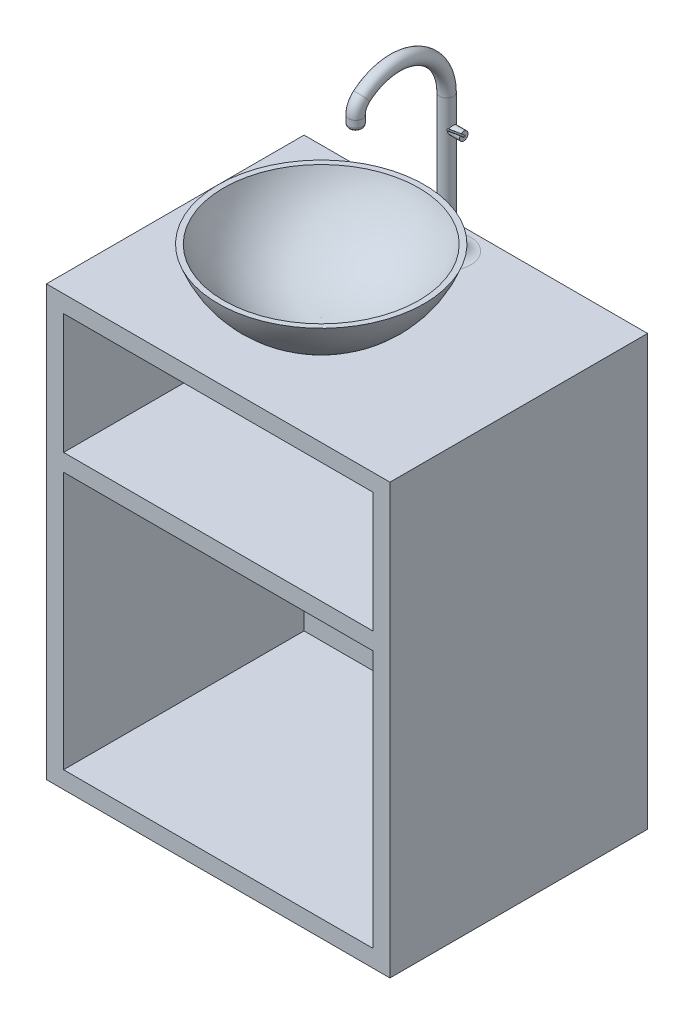
ISO-10303-21;
HEADER;
FILE_DESCRIPTION(('STEP AP214'),'2;1');
FILE_NAME('part.step','',(''),(''),'','','');
FILE_SCHEMA(('AUTOMOTIVE_DESIGN { 1 0 10303 214 1 1 1 1 }'));
ENDSEC;
DATA;
#1=APPLICATION_CONTEXT('core data for automotive mechanical design processes');
#2=APPLICATION_PROTOCOL_DEFINITION('international standard','automotive_design',2000,#1);
#3=PRODUCT_CONTEXT('',#1,'mechanical');
#4=PRODUCT('Part','Part','',(#3));
#5=PRODUCT_RELATED_PRODUCT_CATEGORY('part','',(#4));
#6=PRODUCT_DEFINITION_FORMATION('','',#4);
#7=PRODUCT_DEFINITION_CONTEXT('part definition',#1,'design');
#8=PRODUCT_DEFINITION('design','',#6,#7);
#9=PRODUCT_DEFINITION_SHAPE('','',#8);
#10=(LENGTH_UNIT() NAMED_UNIT(*) SI_UNIT(.MILLI.,.METRE.));
#11=(NAMED_UNIT(*) PLANE_ANGLE_UNIT() SI_UNIT($,.RADIAN.));
#12=(NAMED_UNIT(*) SI_UNIT($,.STERADIAN.) SOLID_ANGLE_UNIT());
#13=UNCERTAINTY_MEASURE_WITH_UNIT(LENGTH_MEASURE(1.E-05),#10,'distance_accuracy_value','');
#14=(GEOMETRIC_REPRESENTATION_CONTEXT(3) GLOBAL_UNCERTAINTY_ASSIGNED_CONTEXT((#13)) GLOBAL_UNIT_ASSIGNED_CONTEXT((#10,
#11,#12)) REPRESENTATION_CONTEXT('',''));
#15=CARTESIAN_POINT('',(0.,0.,0.));
#16=DIRECTION('',(0.,0.,1.));
#17=DIRECTION('',(1.,0.,0.));
#18=AXIS2_PLACEMENT_3D('',#15,#16,#17);
#19=CARTESIAN_POINT('',(0.,12.5,1.7));
#20=DIRECTION('',(0.,1.,0.));
#21=DIRECTION('',(-1.,0.,0.));
#22=AXIS2_PLACEMENT_3D('',#19,#20,#21);
#23=CYLINDRICAL_SURFACE('',#22,0.4);
#24=CARTESIAN_POINT('',(0.,20.5,1.7));
#25=DIRECTION('',(0.,1.,0.));
#26=DIRECTION('',(0.,0.,1.));
#27=AXIS2_PLACEMENT_3D('',#24,#25,#26);
#28=CIRCLE('',#27,0.4);
#29=CARTESIAN_POINT('',(0.,20.5,1.3));
#30=VERTEX_POINT('',#29);
#31=EDGE_CURVE('E202',#30,#30,#28,.T.);
#32=ORIENTED_EDGE('',*,*,#31,.F.);
#33=EDGE_LOOP('',(#32));
#34=FACE_BOUND('',#33,.T.);
#35=CARTESIAN_POINT('',(0.,13.5,1.7));
#36=DIRECTION('',(0.,-1.,0.));
#37=DIRECTION('',(0.,0.,-1.));
#38=AXIS2_PLACEMENT_3D('',#35,#36,#37);
#39=CIRCLE('',#38,0.4);
#40=CARTESIAN_POINT('',(0.,13.5,1.3));
#41=VERTEX_POINT('',#40);
#42=EDGE_CURVE('E336',#41,#41,#39,.F.);
#43=ORIENTED_EDGE('',*,*,#42,.T.);
#44=EDGE_LOOP('',(#43));
#45=FACE_BOUND('',#44,.T.);
#46=CARTESIAN_POINT('',(0.399999999999999,18.55,1.7));
#47=CARTESIAN_POINT('',(0.39999919060617,18.5500008700013,1.71270209460123));
#48=CARTESIAN_POINT('',(0.399388646620892,18.550974602364,1.72541928821109));
#49=CARTESIAN_POINT('',(0.397004335449314,18.5548171606855,1.75046365245271));
#50=CARTESIAN_POINT('',(0.395228351149767,18.5576895987849,1.76279003265964));
#51=CARTESIAN_POINT('',(0.390691705964292,18.5651622726326,1.78664111162753));
#52=CARTESIAN_POINT('',(0.387935921558522,18.5697539575684,1.79816944873335));
#53=CARTESIAN_POINT('',(0.381669196970948,18.5804771701591,1.82025207377333));
#54=CARTESIAN_POINT('',(0.378158340465776,18.586608527201,1.83080646945403));
#55=CARTESIAN_POINT('',(0.370340305809691,18.6007773146379,1.85159483843489));
#56=CARTESIAN_POINT('',(0.365991924469242,18.6089278599984,1.86173591215898));
#57=CARTESIAN_POINT('',(0.357062699807225,18.626643834898,1.88059727502436));
#58=CARTESIAN_POINT('',(0.352481549642063,18.6362111656392,1.88931562142447));
#59=CARTESIAN_POINT('',(0.34286083739574,18.6580067788547,1.90628574649522));
#60=CARTESIAN_POINT('',(0.337843222325162,18.6704199573766,1.91431441214198));
#61=CARTESIAN_POINT('',(0.328660396382606,18.6967129631129,1.92814793211245));
#62=CARTESIAN_POINT('',(0.324493751652602,18.7105902624657,1.93395654179777));
#63=CARTESIAN_POINT('',(0.318619151509393,18.7357621047799,1.94186680116899));
#64=CARTESIAN_POINT('',(0.316553812930075,18.7467933638226,1.9445391047796));
#65=CARTESIAN_POINT('',(0.313562715600758,18.769261185245,1.9483636872148));
#66=CARTESIAN_POINT('',(0.312635347602301,18.7806971516953,1.94951811269557));
#67=CARTESIAN_POINT('',(0.312059771309668,18.8036826033258,1.95023783648051));
#68=CARTESIAN_POINT('',(0.31241491747487,18.8152323072859,1.94979896745278));
#69=CARTESIAN_POINT('',(0.31435480483646,18.8380620206444,1.94735263409654));
#70=CARTESIAN_POINT('',(0.315940531552418,18.8493418064096,1.94534391253086));
#71=CARTESIAN_POINT('',(0.320065146225779,18.8710876905298,1.93993620674219));
#72=CARTESIAN_POINT('',(0.322581430204835,18.8815664911364,1.93657003347359));
#73=CARTESIAN_POINT('',(0.328291132891606,18.9018322364815,1.92858037964208));
#74=CARTESIAN_POINT('',(0.331484791004094,18.911618934975,1.92395645438745));
#75=CARTESIAN_POINT('',(0.338909631984394,18.9321666547664,1.91258978590983));
#76=CARTESIAN_POINT('',(0.343223183151475,18.942768162024,1.90561259320232));
#77=CARTESIAN_POINT('',(0.35201142358293,18.9627660558001,1.89017629260044));
#78=CARTESIAN_POINT('',(0.356486274672079,18.9721611863413,1.88171566160229));
#79=CARTESIAN_POINT('',(0.365959789833566,18.9910603498741,1.86190394260466));
#80=CARTESIAN_POINT('',(0.370923063353148,19.0003265948518,1.85030627071906));
#81=CARTESIAN_POINT('',(0.380056110124929,19.0167701791774,1.82542961991871));
#82=CARTESIAN_POINT('',(0.384226195029536,19.0239483395458,1.8121513047764));
#83=CARTESIAN_POINT('',(0.391106745922625,19.0355527376763,1.78497671258695));
#84=CARTESIAN_POINT('',(0.393883953183153,19.0401068079962,1.77115269154647));
#85=CARTESIAN_POINT('',(0.39796985862009,19.0467529855966,1.742722430915));
#86=CARTESIAN_POINT('',(0.39928063598011,19.0488485788444,1.72811732966827));
#87=CARTESIAN_POINT('',(0.400195681080207,19.0503131700122,1.70090312374811));
#88=CARTESIAN_POINT('',(0.40002432269111,19.0500406355908,1.68831944516721));
#89=CARTESIAN_POINT('',(0.398517802988563,19.0476234343159,1.66340557640077));
#90=CARTESIAN_POINT('',(0.39718272094685,19.0454788949816,1.65107536900757));
#91=CARTESIAN_POINT('',(0.393548104566457,19.0395522926616,1.62749578586825));
#92=CARTESIAN_POINT('',(0.391288341054854,19.0358375686405,1.61622299800894));
#93=CARTESIAN_POINT('',(0.385991368208334,19.0269407221445,1.59447234378622));
#94=CARTESIAN_POINT('',(0.382954028696179,19.0217583539497,1.5839946109074));
#95=CARTESIAN_POINT('',(0.375980024716791,19.0094969588001,1.56298318874284));
#96=CARTESIAN_POINT('',(0.371983529653166,19.0022792861493,1.55255060642466));
#97=CARTESIAN_POINT('',(0.363613939984694,18.9864412269725,1.53297147196319));
#98=CARTESIAN_POINT('',(0.359240429582572,18.9778192821605,1.52382636976658));
#99=CARTESIAN_POINT('',(0.349811739506423,18.9579729921041,1.50570516036657));
#100=CARTESIAN_POINT('',(0.344749767149927,18.9465525586882,1.49694629600613));
#101=CARTESIAN_POINT('',(0.335133525813926,18.9222248429585,1.48143929611524));
#102=CARTESIAN_POINT('',(0.330578906720346,18.9093185986365,1.47468976853544));
#103=CARTESIAN_POINT('',(0.323467060569216,18.8850615703983,1.4646304559976));
#104=CARTESIAN_POINT('',(0.320691272371504,18.8739518498561,1.46089620827473));
#105=CARTESIAN_POINT('',(0.316210061343561,18.8511213708436,1.45499978358383));
#106=CARTESIAN_POINT('',(0.314502966489492,18.839401598109,1.45283515003222));
#107=CARTESIAN_POINT('',(0.312412649973155,18.8155819446246,1.45019723269422));
#108=CARTESIAN_POINT('',(0.31203700334807,18.8034802829026,1.4497336260738));
#109=CARTESIAN_POINT('',(0.312698126220762,18.7793738079266,1.45056044256598));
#110=CARTESIAN_POINT('',(0.313735365191133,18.767369028198,1.4518514486997));
#111=CARTESIAN_POINT('',(0.316910777542705,18.7447940409898,1.45592345519321));
#112=CARTESIAN_POINT('',(0.318953616103162,18.7341861397169,1.45857616100018));
#113=CARTESIAN_POINT('',(0.32383506087034,18.7135729880826,1.46516475306126));
#114=CARTESIAN_POINT('',(0.326673998843327,18.7035679910918,1.46910117440233));
#115=CARTESIAN_POINT('',(0.333327805777765,18.6828806512262,1.47879461911946));
#116=CARTESIAN_POINT('',(0.337224461016908,18.6723099403078,1.48473271108386));
#117=CARTESIAN_POINT('',(0.345335412804811,18.6522123265477,1.49799996593245));
#118=CARTESIAN_POINT('',(0.349549964482648,18.6426862774763,1.50533025344622));
#119=CARTESIAN_POINT('',(0.358803821547984,18.6229971490171,1.52286595569434));
#120=CARTESIAN_POINT('',(0.363841083965482,18.6130818309653,1.53335326505716));
#121=CARTESIAN_POINT('',(0.373397458415354,18.5951010341329,1.55603551071766));
#122=CARTESIAN_POINT('',(0.377916248721884,18.5870367008663,1.5682314969824));
#123=CARTESIAN_POINT('',(0.385973421961887,18.5730457739201,1.59412892001762));
#124=CARTESIAN_POINT('',(0.389510143044564,18.56712279878,1.60783285448334));
#125=CARTESIAN_POINT('',(0.395163043630632,18.5577856230139,1.63632105733881));
#126=CARTESIAN_POINT('',(0.397284242910525,18.5543625530087,1.65110129975402));
#127=CARTESIAN_POINT('',(0.399038944316131,18.5515401581745,1.67171630376043));
#128=CARTESIAN_POINT('',(0.399398344447066,18.5509636269351,1.6773502782289));
#129=CARTESIAN_POINT('',(0.399879060432015,18.5501933416906,1.68865516270111));
#130=CARTESIAN_POINT('',(0.400000361549811,18.5499996113773,1.69432607496918));
#131=CARTESIAN_POINT('',(0.399999999999999,18.55,1.7));
#132=B_SPLINE_CURVE_WITH_KNOTS('',3,(#46,#47,#48,#49,#50,#51,#52,#53,#54,#55,#56,#57,#58,#59,
#60,#61,#62,#63,#64,#65,#66,#67,#68,#69,#70,#71,#72,#73,#74,#75,#76,#77,#78,#79,#80,#81,#82,#83,
#84,#85,#86,#87,#88,#89,#90,#91,#92,#93,#94,#95,#96,#97,#98,#99,#100,#101,#102,#103,#104,#105,
#106,#107,#108,#109,#110,#111,#112,#113,#114,#115,#116,#117,#118,#119,#120,#121,#122,#123,#124,
#125,#126,#127,#128,#129,#130,#131),.UNSPECIFIED.,.T.,.F.,(4,2,2,2,2,2,2,2,2,2,2,2,2,2,2,2,2,2,
2,2,2,2,2,2,2,2,2,2,2,2,2,2,2,2,2,2,2,2,2,2,2,2,4),(0.,0.0380824602868265,0.0762375788256922,
0.114205397519028,0.15216901080776,0.193164374107244,0.234215256651403,0.280825951704689,
0.327357449208691,0.36182401771089,0.396241789318344,0.430749646901123,0.465285168913729,
0.499031678824439,0.53279013571963,0.572854900612281,0.612961045053929,0.659684361302608,
0.706389281359285,0.750568348175482,0.794684695819826,0.83225436109871,0.869821467368124,
0.905919008966159,0.942022597760496,0.981770461884669,1.02156273755893,1.06713141763228,
1.11266845429643,1.14865988053005,1.18459485472932,1.22073394927901,1.25688505503034,
1.2901263379781,1.3233814945295,1.36145104597657,1.39955148221016,1.44520107797777,
1.49087884907221,1.53663345115827,1.5822249218641,1.59923500244025,1.61624613575646),.UNSPECIFIED.);
#133=CARTESIAN_POINT('',(0.399999999999999,18.55,1.7));
#134=VERTEX_POINT('',#133);
#135=EDGE_CURVE('E196',#134,#134,#132,.T.);
#136=ORIENTED_EDGE('',*,*,#135,.T.);
#137=EDGE_LOOP('',(#136));
#138=FACE_BOUND('',#137,.T.);
#139=ADVANCED_FACE('F35',(#34,#45,#138),#23,.T.);
#140=CARTESIAN_POINT('',(10.,12.5,15.));
#141=DIRECTION('',(-1.,0.,0.));
#142=DIRECTION('',(0.,-1.,0.));
#143=AXIS2_PLACEMENT_3D('',#140,#141,#142);
#144=PLANE('',#143);
#145=DIRECTION('',(0.,1.,0.));
#146=VECTOR('',#145,1.);
#147=CARTESIAN_POINT('',(10.,12.5,0.));
#148=LINE('',#147,#146);
#149=CARTESIAN_POINT('',(10.,-12.5,0.));
#150=VERTEX_POINT('',#149);
#151=CARTESIAN_POINT('',(10.,12.5,0.));
#152=VERTEX_POINT('',#151);
#153=EDGE_CURVE('E268',#150,#152,#148,.T.);
#154=ORIENTED_EDGE('',*,*,#153,.T.);
#155=DIRECTION('',(0.,0.,-1.));
#156=VECTOR('',#155,1.);
#157=CARTESIAN_POINT('',(10.,12.5,15.));
#158=LINE('',#157,#156);
#159=CARTESIAN_POINT('',(10.,12.5,15.));
#160=VERTEX_POINT('',#159);
#161=EDGE_CURVE('E331',#160,#152,#158,.T.);
#162=ORIENTED_EDGE('',*,*,#161,.F.);
#163=DIRECTION('',(0.,1.,0.));
#164=VECTOR('',#163,1.);
#165=CARTESIAN_POINT('',(10.,12.5,15.));
#166=LINE('',#165,#164);
#167=CARTESIAN_POINT('',(10.,-12.5,15.));
#168=VERTEX_POINT('',#167);
#169=EDGE_CURVE('E305',#168,#160,#166,.T.);
#170=ORIENTED_EDGE('',*,*,#169,.F.);
#171=DIRECTION('',(0.,0.,-1.));
#172=VECTOR('',#171,1.);
#173=CARTESIAN_POINT('',(10.,-12.5,15.));
#174=LINE('',#173,#172);
#175=EDGE_CURVE('E315',#168,#150,#174,.T.);
#176=ORIENTED_EDGE('',*,*,#175,.T.);
#177=EDGE_LOOP('',(#154,#162,#170,#176));
#178=FACE_BOUND('',#177,.T.);
#179=ADVANCED_FACE('F181',(#178),#144,.F.);
#180=CARTESIAN_POINT('',(-10.,12.5,15.));
#181=DIRECTION('',(0.,-1.,0.));
#182=DIRECTION('',(0.,0.,-1.));
#183=AXIS2_PLACEMENT_3D('',#180,#181,#182);
#184=PLANE('',#183);
#185=CARTESIAN_POINT('',(0.,12.5,1.7));
#186=DIRECTION('',(0.,-1.,0.));
#187=DIRECTION('',(0.,0.,-1.));
#188=AXIS2_PLACEMENT_3D('',#185,#186,#187);
#189=CIRCLE('',#188,1.4);
#190=CARTESIAN_POINT('',(0.,12.5,0.3));
#191=VERTEX_POINT('',#190);
#192=EDGE_CURVE('E145',#191,#191,#189,.T.);
#193=ORIENTED_EDGE('',*,*,#192,.T.);
#194=EDGE_LOOP('',(#193));
#195=FACE_BOUND('',#194,.T.);
#196=CARTESIAN_POINT('',(0.,12.5,9.));
#197=DIRECTION('',(0.,-1.,0.));
#198=DIRECTION('',(0.,0.,-1.));
#199=AXIS2_PLACEMENT_3D('',#196,#197,#198);
#200=CIRCLE('',#199,0.679502625910585);
#201=CARTESIAN_POINT('',(0.,12.5,8.32049737408941));
#202=VERTEX_POINT('',#201);
#203=EDGE_CURVE('E334',#202,#202,#200,.F.);
#204=ORIENTED_EDGE('',*,*,#203,.F.);
#205=EDGE_LOOP('',(#204));
#206=FACE_BOUND('',#205,.T.);
#207=DIRECTION('',(-1.,0.,0.));
#208=VECTOR('',#207,1.);
#209=CARTESIAN_POINT('',(-10.,12.5,0.));
#210=LINE('',#209,#208);
#211=CARTESIAN_POINT('',(-10.,12.5,0.));
#212=VERTEX_POINT('',#211);
#213=EDGE_CURVE('E318',#152,#212,#210,.T.);
#214=ORIENTED_EDGE('',*,*,#213,.T.);
#215=DIRECTION('',(0.,0.,-1.));
#216=VECTOR('',#215,1.);
#217=CARTESIAN_POINT('',(-10.,12.5,15.));
#218=LINE('',#217,#216);
#219=CARTESIAN_POINT('',(-10.,12.5,15.));
#220=VERTEX_POINT('',#219);
#221=EDGE_CURVE('E328',#220,#212,#218,.T.);
#222=ORIENTED_EDGE('',*,*,#221,.F.);
#223=DIRECTION('',(-1.,0.,0.));
#224=VECTOR('',#223,1.);
#225=CARTESIAN_POINT('',(-10.,12.5,15.));
#226=LINE('',#225,#224);
#227=EDGE_CURVE('E308',#160,#220,#226,.T.);
#228=ORIENTED_EDGE('',*,*,#227,.F.);
#229=ORIENTED_EDGE('',*,*,#161,.T.);
#230=EDGE_LOOP('',(#214,#222,#228,#229));
#231=FACE_BOUND('',#230,.T.);
#232=ADVANCED_FACE('F186',(#195,#206,#231),#184,.F.);
#233=CARTESIAN_POINT('',(-10.,12.5,15.));
#234=DIRECTION('',(1.,0.,0.));
#235=DIRECTION('',(0.,1.,0.));
#236=AXIS2_PLACEMENT_3D('',#233,#234,#235);
#237=PLANE('',#236);
#238=DIRECTION('',(0.,-1.,0.));
#239=VECTOR('',#238,1.);
#240=CARTESIAN_POINT('',(-10.,12.5,0.));
#241=LINE('',#240,#239);
#242=CARTESIAN_POINT('',(-10.,-12.5,0.));
#243=VERTEX_POINT('',#242);
#244=EDGE_CURVE('E320',#212,#243,#241,.T.);
#245=ORIENTED_EDGE('',*,*,#244,.T.);
#246=DIRECTION('',(0.,0.,-1.));
#247=VECTOR('',#246,1.);
#248=CARTESIAN_POINT('',(-10.,-12.5,15.));
#249=LINE('',#248,#247);
#250=CARTESIAN_POINT('',(-10.,-12.5,15.));
#251=VERTEX_POINT('',#250);
#252=EDGE_CURVE('E325',#251,#243,#249,.T.);
#253=ORIENTED_EDGE('',*,*,#252,.F.);
#254=DIRECTION('',(0.,-1.,0.));
#255=VECTOR('',#254,1.);
#256=CARTESIAN_POINT('',(-10.,12.5,15.));
#257=LINE('',#256,#255);
#258=EDGE_CURVE('E311',#220,#251,#257,.T.);
#259=ORIENTED_EDGE('',*,*,#258,.F.);
#260=ORIENTED_EDGE('',*,*,#221,.T.);
#261=EDGE_LOOP('',(#245,#253,#259,#260));
#262=FACE_BOUND('',#261,.T.);
#263=ADVANCED_FACE('F421',(#262),#237,.F.);
#264=CARTESIAN_POINT('',(-10.,-12.5,15.));
#265=DIRECTION('',(0.,1.,0.));
#266=DIRECTION('',(0.,0.,1.));
#267=AXIS2_PLACEMENT_3D('',#264,#265,#266);
#268=PLANE('',#267);
#269=DIRECTION('',(1.,0.,0.));
#270=VECTOR('',#269,1.);
#271=CARTESIAN_POINT('',(-10.,-12.5,0.));
#272=LINE('',#271,#270);
#273=EDGE_CURVE('E309',#243,#150,#272,.T.);
#274=ORIENTED_EDGE('',*,*,#273,.T.);
#275=ORIENTED_EDGE('',*,*,#175,.F.);
#276=DIRECTION('',(1.,0.,0.));
#277=VECTOR('',#276,1.);
#278=CARTESIAN_POINT('',(-10.,-12.5,15.));
#279=LINE('',#278,#277);
#280=EDGE_CURVE('E313',#251,#168,#279,.T.);
#281=ORIENTED_EDGE('',*,*,#280,.F.);
#282=ORIENTED_EDGE('',*,*,#252,.T.);
#283=EDGE_LOOP('',(#274,#275,#281,#282));
#284=FACE_BOUND('',#283,.T.);
#285=ADVANCED_FACE('F414',(#284),#268,.F.);
#286=CARTESIAN_POINT('',(0.,0.,15.));
#287=DIRECTION('',(0.,0.,1.));
#288=DIRECTION('',(1.,0.,0.));
#289=AXIS2_PLACEMENT_3D('',#286,#287,#288);
#290=PLANE('',#289);
#291=DIRECTION('',(0.,1.,0.));
#292=VECTOR('',#291,1.);
#293=CARTESIAN_POINT('',(9.,11.5,15.));
#294=LINE('',#293,#292);
#295=CARTESIAN_POINT('',(9.,4.5,15.));
#296=VERTEX_POINT('',#295);
#297=CARTESIAN_POINT('',(9.,11.5,15.));
#298=VERTEX_POINT('',#297);
#299=EDGE_CURVE('E255',#296,#298,#294,.T.);
#300=ORIENTED_EDGE('',*,*,#299,.F.);
#301=DIRECTION('',(1.,0.,0.));
#302=VECTOR('',#301,1.);
#303=CARTESIAN_POINT('',(-9.,4.5,15.));
#304=LINE('',#303,#302);
#305=CARTESIAN_POINT('',(-9.,4.5,15.));
#306=VERTEX_POINT('',#305);
#307=EDGE_CURVE('E245',#306,#296,#304,.T.);
#308=ORIENTED_EDGE('',*,*,#307,.F.);
#309=DIRECTION('',(0.,-1.,0.));
#310=VECTOR('',#309,1.);
#311=CARTESIAN_POINT('',(-9.,11.5,15.));
#312=LINE('',#311,#310);
#313=CARTESIAN_POINT('',(-9.,11.5,15.));
#314=VERTEX_POINT('',#313);
#315=EDGE_CURVE('E261',#314,#306,#312,.T.);
#316=ORIENTED_EDGE('',*,*,#315,.F.);
#317=DIRECTION('',(-1.,0.,0.));
#318=VECTOR('',#317,1.);
#319=CARTESIAN_POINT('',(-9.,11.5,15.));
#320=LINE('',#319,#318);
#321=EDGE_CURVE('E257',#298,#314,#320,.T.);
#322=ORIENTED_EDGE('',*,*,#321,.F.);
#323=EDGE_LOOP('',(#300,#308,#316,#322));
#324=FACE_BOUND('',#323,.T.);
#325=DIRECTION('',(0.,1.,0.));
#326=VECTOR('',#325,1.);
#327=CARTESIAN_POINT('',(9.,3.5,15.));
#328=LINE('',#327,#326);
#329=CARTESIAN_POINT('',(9.00000000000001,-11.5,15.));
#330=VERTEX_POINT('',#329);
#331=CARTESIAN_POINT('',(9.,3.5,15.));
#332=VERTEX_POINT('',#331);
#333=EDGE_CURVE('E240',#330,#332,#328,.T.);
#334=ORIENTED_EDGE('',*,*,#333,.F.);
#335=DIRECTION('',(1.,0.,0.));
#336=VECTOR('',#335,1.);
#337=CARTESIAN_POINT('',(-9.,-11.5,15.));
#338=LINE('',#337,#336);
#339=CARTESIAN_POINT('',(-9.,-11.5,15.));
#340=VERTEX_POINT('',#339);
#341=EDGE_CURVE('E279',#340,#330,#338,.T.);
#342=ORIENTED_EDGE('',*,*,#341,.F.);
#343=DIRECTION('',(0.,-1.,0.));
#344=VECTOR('',#343,1.);
#345=CARTESIAN_POINT('',(-9.,3.5,15.));
#346=LINE('',#345,#344);
#347=CARTESIAN_POINT('',(-9.,3.5,15.));
#348=VERTEX_POINT('',#347);
#349=EDGE_CURVE('E293',#348,#340,#346,.T.);
#350=ORIENTED_EDGE('',*,*,#349,.F.);
#351=DIRECTION('',(-1.,0.,0.));
#352=VECTOR('',#351,1.);
#353=CARTESIAN_POINT('',(-9.,3.5,15.));
#354=LINE('',#353,#352);
#355=EDGE_CURVE('E290',#332,#348,#354,.T.);
#356=ORIENTED_EDGE('',*,*,#355,.F.);
#357=EDGE_LOOP('',(#334,#342,#350,#356));
#358=FACE_BOUND('',#357,.T.);
#359=ORIENTED_EDGE('',*,*,#169,.T.);
#360=ORIENTED_EDGE('',*,*,#227,.T.);
#361=ORIENTED_EDGE('',*,*,#258,.T.);
#362=ORIENTED_EDGE('',*,*,#280,.T.);
#363=EDGE_LOOP('',(#359,#360,#361,#362));
#364=FACE_BOUND('',#363,.T.);
#365=ADVANCED_FACE('F411',(#324,#358,#364),#290,.T.);
#366=CARTESIAN_POINT('',(0.,0.,0.));
#367=DIRECTION('',(0.,0.,1.));
#368=DIRECTION('',(1.,0.,0.));
#369=AXIS2_PLACEMENT_3D('',#366,#367,#368);
#370=PLANE('',#369);
#371=ORIENTED_EDGE('',*,*,#153,.F.);
#372=ORIENTED_EDGE('',*,*,#273,.F.);
#373=ORIENTED_EDGE('',*,*,#244,.F.);
#374=ORIENTED_EDGE('',*,*,#213,.F.);
#375=EDGE_LOOP('',(#371,#372,#373,#374));
#376=FACE_BOUND('',#375,.T.);
#377=ADVANCED_FACE('F409',(#376),#370,.F.);
#378=CARTESIAN_POINT('',(9.,3.5,0.999999999999999));
#379=DIRECTION('',(1.,0.,0.));
#380=DIRECTION('',(0.,1.,0.));
#381=AXIS2_PLACEMENT_3D('',#378,#379,#380);
#382=PLANE('',#381);
#383=ORIENTED_EDGE('',*,*,#333,.T.);
#384=DIRECTION('',(0.,0.,1.));
#385=VECTOR('',#384,1.);
#386=CARTESIAN_POINT('',(9.,3.5,0.999999999999999));
#387=LINE('',#386,#385);
#388=CARTESIAN_POINT('',(9.,3.5,0.999999999999999));
#389=VERTEX_POINT('',#388);
#390=EDGE_CURVE('E288',#389,#332,#387,.T.);
#391=ORIENTED_EDGE('',*,*,#390,.F.);
#392=DIRECTION('',(0.,1.,0.));
#393=VECTOR('',#392,1.);
#394=CARTESIAN_POINT('',(9.,3.5,0.999999999999999));
#395=LINE('',#394,#393);
#396=CARTESIAN_POINT('',(9.00000000000001,-11.5,0.999999999999999));
#397=VERTEX_POINT('',#396);
#398=EDGE_CURVE('E275',#397,#389,#395,.T.);
#399=ORIENTED_EDGE('',*,*,#398,.F.);
#400=DIRECTION('',(0.,0.,1.));
#401=VECTOR('',#400,1.);
#402=CARTESIAN_POINT('',(9.00000000000001,-11.5,0.999999999999999));
#403=LINE('',#402,#401);
#404=EDGE_CURVE('E258',#397,#330,#403,.T.);
#405=ORIENTED_EDGE('',*,*,#404,.T.);
#406=EDGE_LOOP('',(#383,#391,#399,#405));
#407=FACE_BOUND('',#406,.T.);
#408=ADVANCED_FACE('F399',(#407),#382,.F.);
#409=CARTESIAN_POINT('',(-9.,-11.5,0.999999999999999));
#410=DIRECTION('',(0.,-1.,0.));
#411=DIRECTION('',(0.,0.,-1.));
#412=AXIS2_PLACEMENT_3D('',#409,#410,#411);
#413=PLANE('',#412);
#414=ORIENTED_EDGE('',*,*,#341,.T.);
#415=ORIENTED_EDGE('',*,*,#404,.F.);
#416=DIRECTION('',(1.,0.,0.));
#417=VECTOR('',#416,1.);
#418=CARTESIAN_POINT('',(-9.,-11.5,0.999999999999999));
#419=LINE('',#418,#417);
#420=CARTESIAN_POINT('',(-9.,-11.5,0.999999999999999));
#421=VERTEX_POINT('',#420);
#422=EDGE_CURVE('E285',#421,#397,#419,.T.);
#423=ORIENTED_EDGE('',*,*,#422,.F.);
#424=DIRECTION('',(0.,0.,1.));
#425=VECTOR('',#424,1.);
#426=CARTESIAN_POINT('',(-9.,-11.5,0.999999999999999));
#427=LINE('',#426,#425);
#428=EDGE_CURVE('E299',#421,#340,#427,.T.);
#429=ORIENTED_EDGE('',*,*,#428,.T.);
#430=EDGE_LOOP('',(#414,#415,#423,#429));
#431=FACE_BOUND('',#430,.T.);
#432=ADVANCED_FACE('F395',(#431),#413,.F.);
#433=CARTESIAN_POINT('',(-9.,3.5,0.999999999999999));
#434=DIRECTION('',(-1.,0.,0.));
#435=DIRECTION('',(0.,0.,1.));
#436=AXIS2_PLACEMENT_3D('',#433,#434,#435);
#437=PLANE('',#436);
#438=ORIENTED_EDGE('',*,*,#349,.T.);
#439=ORIENTED_EDGE('',*,*,#428,.F.);
#440=DIRECTION('',(0.,-1.,0.));
#441=VECTOR('',#440,1.);
#442=CARTESIAN_POINT('',(-9.,3.5,0.999999999999999));
#443=LINE('',#442,#441);
#444=CARTESIAN_POINT('',(-9.,3.5,0.999999999999999));
#445=VERTEX_POINT('',#444);
#446=EDGE_CURVE('E282',#445,#421,#443,.T.);
#447=ORIENTED_EDGE('',*,*,#446,.F.);
#448=DIRECTION('',(0.,0.,1.));
#449=VECTOR('',#448,1.);
#450=CARTESIAN_POINT('',(-9.,3.5,0.999999999999999));
#451=LINE('',#450,#449);
#452=EDGE_CURVE('E301',#445,#348,#451,.T.);
#453=ORIENTED_EDGE('',*,*,#452,.T.);
#454=EDGE_LOOP('',(#438,#439,#447,#453));
#455=FACE_BOUND('',#454,.T.);
#456=ADVANCED_FACE('F398',(#455),#437,.F.);
#457=CARTESIAN_POINT('',(-9.,3.5,0.999999999999999));
#458=DIRECTION('',(0.,1.,0.));
#459=DIRECTION('',(0.,0.,1.));
#460=AXIS2_PLACEMENT_3D('',#457,#458,#459);
#461=PLANE('',#460);
#462=ORIENTED_EDGE('',*,*,#355,.T.);
#463=ORIENTED_EDGE('',*,*,#452,.F.);
#464=DIRECTION('',(-1.,0.,0.));
#465=VECTOR('',#464,1.);
#466=CARTESIAN_POINT('',(-9.,3.5,0.999999999999999));
#467=LINE('',#466,#465);
#468=EDGE_CURVE('E278',#389,#445,#467,.T.);
#469=ORIENTED_EDGE('',*,*,#468,.F.);
#470=ORIENTED_EDGE('',*,*,#390,.T.);
#471=EDGE_LOOP('',(#462,#463,#469,#470));
#472=FACE_BOUND('',#471,.T.);
#473=ADVANCED_FACE('F393',(#472),#461,.F.);
#474=CARTESIAN_POINT('',(0.,0.,0.999999999999999));
#475=DIRECTION('',(0.,0.,1.));
#476=DIRECTION('',(1.,0.,0.));
#477=AXIS2_PLACEMENT_3D('',#474,#475,#476);
#478=PLANE('',#477);
#479=ORIENTED_EDGE('',*,*,#398,.T.);
#480=ORIENTED_EDGE('',*,*,#468,.T.);
#481=ORIENTED_EDGE('',*,*,#446,.T.);
#482=ORIENTED_EDGE('',*,*,#422,.T.);
#483=EDGE_LOOP('',(#479,#480,#481,#482));
#484=FACE_BOUND('',#483,.T.);
#485=ADVANCED_FACE('F389',(#484),#478,.T.);
#486=CARTESIAN_POINT('',(9.,11.5,0.999999999999999));
#487=DIRECTION('',(1.,0.,0.));
#488=DIRECTION('',(0.,0.,-1.));
#489=AXIS2_PLACEMENT_3D('',#486,#487,#488);
#490=PLANE('',#489);
#491=ORIENTED_EDGE('',*,*,#299,.T.);
#492=DIRECTION('',(0.,0.,1.));
#493=VECTOR('',#492,1.);
#494=CARTESIAN_POINT('',(9.,11.5,0.999999999999999));
#495=LINE('',#494,#493);
#496=CARTESIAN_POINT('',(9.,11.5,0.999999999999999));
#497=VERTEX_POINT('',#496);
#498=EDGE_CURVE('E254',#497,#298,#495,.T.);
#499=ORIENTED_EDGE('',*,*,#498,.F.);
#500=DIRECTION('',(0.,1.,0.));
#501=VECTOR('',#500,1.);
#502=CARTESIAN_POINT('',(9.,11.5,0.999999999999999));
#503=LINE('',#502,#501);
#504=CARTESIAN_POINT('',(9.,4.5,0.999999999999999));
#505=VERTEX_POINT('',#504);
#506=EDGE_CURVE('E241',#505,#497,#503,.T.);
#507=ORIENTED_EDGE('',*,*,#506,.F.);
#508=DIRECTION('',(0.,0.,1.));
#509=VECTOR('',#508,1.);
#510=CARTESIAN_POINT('',(9.,4.5,0.999999999999999));
#511=LINE('',#510,#509);
#512=EDGE_CURVE('E266',#505,#296,#511,.T.);
#513=ORIENTED_EDGE('',*,*,#512,.T.);
#514=EDGE_LOOP('',(#491,#499,#507,#513));
#515=FACE_BOUND('',#514,.T.);
#516=ADVANCED_FACE('F379',(#515),#490,.F.);
#517=CARTESIAN_POINT('',(-9.,4.5,0.999999999999999));
#518=DIRECTION('',(0.,-1.,0.));
#519=DIRECTION('',(0.,0.,-1.));
#520=AXIS2_PLACEMENT_3D('',#517,#518,#519);
#521=PLANE('',#520);
#522=ORIENTED_EDGE('',*,*,#307,.T.);
#523=ORIENTED_EDGE('',*,*,#512,.F.);
#524=DIRECTION('',(1.,0.,0.));
#525=VECTOR('',#524,1.);
#526=CARTESIAN_POINT('',(-9.,4.5,0.999999999999999));
#527=LINE('',#526,#525);
#528=CARTESIAN_POINT('',(-9.,4.5,0.999999999999999));
#529=VERTEX_POINT('',#528);
#530=EDGE_CURVE('E251',#529,#505,#527,.T.);
#531=ORIENTED_EDGE('',*,*,#530,.F.);
#532=DIRECTION('',(0.,0.,1.));
#533=VECTOR('',#532,1.);
#534=CARTESIAN_POINT('',(-9.,4.5,0.999999999999999));
#535=LINE('',#534,#533);
#536=EDGE_CURVE('E269',#529,#306,#535,.T.);
#537=ORIENTED_EDGE('',*,*,#536,.T.);
#538=EDGE_LOOP('',(#522,#523,#531,#537));
#539=FACE_BOUND('',#538,.T.);
#540=ADVANCED_FACE('F375',(#539),#521,.F.);
#541=CARTESIAN_POINT('',(-9.,11.5,0.999999999999999));
#542=DIRECTION('',(-1.,0.,0.));
#543=DIRECTION('',(0.,-1.,0.));
#544=AXIS2_PLACEMENT_3D('',#541,#542,#543);
#545=PLANE('',#544);
#546=ORIENTED_EDGE('',*,*,#315,.T.);
#547=ORIENTED_EDGE('',*,*,#536,.F.);
#548=DIRECTION('',(0.,-1.,0.));
#549=VECTOR('',#548,1.);
#550=CARTESIAN_POINT('',(-9.,11.5,0.999999999999999));
#551=LINE('',#550,#549);
#552=CARTESIAN_POINT('',(-9.,11.5,0.999999999999999));
#553=VERTEX_POINT('',#552);
#554=EDGE_CURVE('E248',#553,#529,#551,.T.);
#555=ORIENTED_EDGE('',*,*,#554,.F.);
#556=DIRECTION('',(0.,0.,1.));
#557=VECTOR('',#556,1.);
#558=CARTESIAN_POINT('',(-9.,11.5,0.999999999999999));
#559=LINE('',#558,#557);
#560=EDGE_CURVE('E271',#553,#314,#559,.T.);
#561=ORIENTED_EDGE('',*,*,#560,.T.);
#562=EDGE_LOOP('',(#546,#547,#555,#561));
#563=FACE_BOUND('',#562,.T.);
#564=ADVANCED_FACE('F378',(#563),#545,.F.);
#565=CARTESIAN_POINT('',(-9.,11.5,0.999999999999999));
#566=DIRECTION('',(0.,1.,0.));
#567=DIRECTION('',(0.,0.,1.));
#568=AXIS2_PLACEMENT_3D('',#565,#566,#567);
#569=PLANE('',#568);
#570=ORIENTED_EDGE('',*,*,#321,.T.);
#571=ORIENTED_EDGE('',*,*,#560,.F.);
#572=DIRECTION('',(-1.,0.,0.));
#573=VECTOR('',#572,1.);
#574=CARTESIAN_POINT('',(-9.,11.5,0.999999999999999));
#575=LINE('',#574,#573);
#576=EDGE_CURVE('E244',#497,#553,#575,.T.);
#577=ORIENTED_EDGE('',*,*,#576,.F.);
#578=ORIENTED_EDGE('',*,*,#498,.T.);
#579=EDGE_LOOP('',(#570,#571,#577,#578));
#580=FACE_BOUND('',#579,.T.);
#581=ADVANCED_FACE('F373',(#580),#569,.F.);
#582=CARTESIAN_POINT('',(0.,0.,0.999999999999999));
#583=DIRECTION('',(0.,0.,1.));
#584=DIRECTION('',(1.,0.,0.));
#585=AXIS2_PLACEMENT_3D('',#582,#583,#584);
#586=PLANE('',#585);
#587=ORIENTED_EDGE('',*,*,#506,.T.);
#588=ORIENTED_EDGE('',*,*,#576,.T.);
#589=ORIENTED_EDGE('',*,*,#554,.T.);
#590=ORIENTED_EDGE('',*,*,#530,.T.);
#591=EDGE_LOOP('',(#587,#588,#589,#590));
#592=FACE_BOUND('',#591,.T.);
#593=ADVANCED_FACE('F369',(#592),#586,.T.);
#594=CARTESIAN_POINT('',(0.,18.4903730305671,9.));
#595=DIRECTION('',(0.,-1.,0.));
#596=DIRECTION('',(1.,0.,0.));
#597=AXIS2_PLACEMENT_3D('',#594,#595,#596);
#598=DEGENERATE_TOROIDAL_SURFACE('',#597,0.339751312955295,6.,.T.);
#599=CARTESIAN_POINT('',(0.,16.5,9.));
#600=DIRECTION('',(0.,-1.,0.));
#601=DIRECTION('',(1.,0.,0.));
#602=AXIS2_PLACEMENT_3D('',#599,#600,#601);
#603=CIRCLE('',#602,6.);
#604=CARTESIAN_POINT('',(6.,16.5,9.));
#605=VERTEX_POINT('',#604);
#606=EDGE_CURVE('E226',#605,#605,#603,.T.);
#607=ORIENTED_EDGE('',*,*,#606,.T.);
#608=EDGE_LOOP('',(#607));
#609=FACE_BOUND('',#608,.T.);
#610=ORIENTED_EDGE('',*,*,#203,.T.);
#611=EDGE_LOOP('',(#610));
#612=FACE_BOUND('',#611,.T.);
#613=ADVANCED_FACE('F365',(#609,#612),#598,.T.);
#614=CARTESIAN_POINT('',(0.,12.7995186515284,9.01698756564777));
#615=DIRECTION('',(0.,-1.,0.));
#616=DIRECTION('',(1.,0.,0.));
#617=AXIS2_PLACEMENT_3D('',#614,#615,#616);
#618=PLANE('',#617);
#619=CARTESIAN_POINT('',(0.,12.7995186515284,9.));
#620=DIRECTION('',(0.,-1.,0.));
#621=DIRECTION('',(1.,0.,0.));
#622=AXIS2_PLACEMENT_3D('',#619,#620,#621);
#623=CIRCLE('',#622,0.0169875656477712);
#624=CARTESIAN_POINT('',(0.0169875656477699,12.7995186515284,9.));
#625=VERTEX_POINT('',#624);
#626=EDGE_CURVE('E237',#625,#625,#623,.T.);
#627=ORIENTED_EDGE('',*,*,#626,.F.);
#628=EDGE_LOOP('',(#627));
#629=FACE_BOUND('',#628,.T.);
#630=ADVANCED_FACE('F361',(#629),#618,.F.);
#631=CARTESIAN_POINT('',(0.,18.4903730305671,9.));
#632=DIRECTION('',(0.,-1.,0.));
#633=DIRECTION('',(1.,0.,0.));
#634=AXIS2_PLACEMENT_3D('',#631,#632,#633);
#635=DEGENERATE_TOROIDAL_SURFACE('',#634,0.339751312955295,5.7,.T.);
#636=CARTESIAN_POINT('',(0.,16.5,9.));
#637=DIRECTION('',(0.,-1.,0.));
#638=DIRECTION('',(1.,0.,0.));
#639=AXIS2_PLACEMENT_3D('',#636,#637,#638);
#640=CIRCLE('',#639,5.68095110318888);
#641=CARTESIAN_POINT('',(5.68095110318888,16.5,9.));
#642=VERTEX_POINT('',#641);
#643=EDGE_CURVE('E230',#642,#642,#640,.T.);
#644=ORIENTED_EDGE('',*,*,#643,.F.);
#645=EDGE_LOOP('',(#644));
#646=FACE_BOUND('',#645,.T.);
#647=ORIENTED_EDGE('',*,*,#626,.T.);
#648=EDGE_LOOP('',(#647));
#649=FACE_BOUND('',#648,.T.);
#650=ADVANCED_FACE('F355',(#646,#649),#635,.F.);
#651=CARTESIAN_POINT('',(0.,16.5,15.));
#652=DIRECTION('',(0.,-1.,0.));
#653=DIRECTION('',(1.,0.,0.));
#654=AXIS2_PLACEMENT_3D('',#651,#652,#653);
#655=PLANE('',#654);
#656=ORIENTED_EDGE('',*,*,#606,.F.);
#657=EDGE_LOOP('',(#656));
#658=FACE_BOUND('',#657,.T.);
#659=ORIENTED_EDGE('',*,*,#643,.T.);
#660=EDGE_LOOP('',(#659));
#661=FACE_BOUND('',#660,.T.);
#662=ADVANCED_FACE('F221',(#658,#661),#655,.F.);
#663=CARTESIAN_POINT('',(0.,21.4283628290596,6.99813332935693));
#664=DIRECTION('',(0.,-1.,0.));
#665=DIRECTION('',(0.,0.,-1.));
#666=AXIS2_PLACEMENT_3D('',#663,#664,#665);
#667=PLANE('',#666);
#668=CARTESIAN_POINT('',(0.,21.4283628290596,6.99813332935693));
#669=DIRECTION('',(0.,-1.,0.));
#670=DIRECTION('',(1.,0.,0.));
#671=AXIS2_PLACEMENT_3D('',#668,#669,#670);
#672=CIRCLE('',#671,0.2);
#673=CARTESIAN_POINT('',(0.199999999999999,21.4283628290596,6.99813332935693));
#674=VERTEX_POINT('',#673);
#675=EDGE_CURVE('E43',#674,#674,#672,.T.);
#676=ORIENTED_EDGE('',*,*,#675,.T.);
#677=EDGE_LOOP('',(#676));
#678=FACE_BOUND('',#677,.T.);
#679=ADVANCED_FACE('F208',(#678),#667,.T.);
#680=CARTESIAN_POINT('',(0.,20.5,4.7));
#681=DIRECTION('',(1.,0.,0.));
#682=DIRECTION('',(0.,1.,0.));
#683=AXIS2_PLACEMENT_3D('',#680,#681,#682);
#684=TOROIDAL_SURFACE('',#683,3.,0.4);
#685=CARTESIAN_POINT('',(0.,22.7821945980193,6.64719999403539));
#686=DIRECTION('',(0.,-0.649066664678464,0.760731532673107));
#687=DIRECTION('',(0.,-0.760731532673107,-0.649066664678464));
#688=AXIS2_PLACEMENT_3D('',#685,#686,#687);
#689=CIRCLE('',#688,0.4);
#690=CARTESIAN_POINT('',(0.,23.0864872110886,6.90682665990678));
#691=VERTEX_POINT('',#690);
#692=EDGE_CURVE('E227',#691,#691,#689,.T.);
#693=CARTESIAN_POINT('',(0.,20.5,4.7));
#694=DIRECTION('',(1.,0.,0.));
#695=DIRECTION('',(0.,1.,0.));
#696=AXIS2_PLACEMENT_3D('',#693,#694,#695);
#697=CIRCLE('',#696,3.4);
#698=EDGE_CURVE('',#30,#691,#697,.T.);
#699=ORIENTED_EDGE('',*,*,#31,.T.);
#700=ORIENTED_EDGE('',*,*,#692,.F.);
#701=ORIENTED_EDGE('',*,*,#698,.T.);
#702=ORIENTED_EDGE('',*,*,#698,.F.);
#703=EDGE_LOOP('',(#699,#701,#700,#702));
#704=FACE_BOUND('',#703,.T.);
#705=ADVANCED_FACE('F193',(#704),#684,.T.);
#706=CARTESIAN_POINT('',(0.,22.0214630653462,5.99813332935693));
#707=DIRECTION('',(1.,0.,0.));
#708=DIRECTION('',(0.,1.,0.));
#709=AXIS2_PLACEMENT_3D('',#706,#707,#708);
#710=TOROIDAL_SURFACE('',#709,0.999999999999998,0.4);
#711=CARTESIAN_POINT('',(0.,22.0214630653462,6.99813332935693));
#712=DIRECTION('',(0.,-1.,0.));
#713=DIRECTION('',(0.,0.,-1.));
#714=AXIS2_PLACEMENT_3D('',#711,#712,#713);
#715=CIRCLE('',#714,0.4);
#716=CARTESIAN_POINT('',(0.,22.0214630653462,7.39813332935693));
#717=VERTEX_POINT('',#716);
#718=EDGE_CURVE('E224',#717,#717,#715,.T.);
#719=CARTESIAN_POINT('',(0.,22.0214630653462,5.99813332935693));
#720=DIRECTION('',(1.,0.,0.));
#721=DIRECTION('',(0.,1.,0.));
#722=AXIS2_PLACEMENT_3D('',#719,#720,#721);
#723=CIRCLE('',#722,1.4);
#724=EDGE_CURVE('',#691,#717,#723,.T.);
#725=ORIENTED_EDGE('',*,*,#692,.T.);
#726=ORIENTED_EDGE('',*,*,#718,.F.);
#727=ORIENTED_EDGE('',*,*,#724,.T.);
#728=ORIENTED_EDGE('',*,*,#724,.F.);
#729=EDGE_LOOP('',(#725,#727,#726,#728));
#730=FACE_BOUND('',#729,.T.);
#731=ADVANCED_FACE('F219',(#730),#710,.T.);
#732=CARTESIAN_POINT('',(0.,22.0214630653462,6.99813332935693));
#733=DIRECTION('',(0.,-1.,0.));
#734=DIRECTION('',(1.,0.,0.));
#735=AXIS2_PLACEMENT_3D('',#732,#733,#734);
#736=CYLINDRICAL_SURFACE('',#735,0.4);
#737=CARTESIAN_POINT('',(0.,21.6283628290596,6.99813332935693));
#738=DIRECTION('',(0.,-1.,0.));
#739=DIRECTION('',(1.,0.,0.));
#740=AXIS2_PLACEMENT_3D('',#737,#738,#739);
#741=CIRCLE('',#740,0.4);
#742=CARTESIAN_POINT('',(0.399999999999999,21.6283628290596,6.99813332935693));
#743=VERTEX_POINT('',#742);
#744=EDGE_CURVE('E11',#743,#743,#741,.F.);
#745=ORIENTED_EDGE('',*,*,#744,.T.);
#746=EDGE_LOOP('',(#745));
#747=FACE_BOUND('',#746,.T.);
#748=ORIENTED_EDGE('',*,*,#718,.T.);
#749=EDGE_LOOP('',(#748));
#750=FACE_BOUND('',#749,.T.);
#751=ADVANCED_FACE('F216',(#747,#750),#736,.T.);
#752=CARTESIAN_POINT('',(0.,13.5,1.7));
#753=DIRECTION('',(0.,-1.,0.));
#754=DIRECTION('',(0.,0.,-1.));
#755=AXIS2_PLACEMENT_3D('',#752,#753,#754);
#756=TOROIDAL_SURFACE('',#755,1.4,1.);
#757=ORIENTED_EDGE('',*,*,#192,.F.);
#758=EDGE_LOOP('',(#757));
#759=FACE_BOUND('',#758,.T.);
#760=ORIENTED_EDGE('',*,*,#42,.F.);
#761=EDGE_LOOP('',(#760));
#762=FACE_BOUND('',#761,.T.);
#763=ADVANCED_FACE('F178',(#759,#762),#756,.F.);
#764=CARTESIAN_POINT('',(0.999999999999998,18.8,1.7));
#765=DIRECTION('',(-1.,0.,0.));
#766=DIRECTION('',(0.,-1.,0.));
#767=AXIS2_PLACEMENT_3D('',#764,#765,#766);
#768=CYLINDRICAL_SURFACE('',#767,0.25);
#769=ORIENTED_EDGE('',*,*,#135,.F.);
#770=EDGE_LOOP('',(#769));
#771=FACE_BOUND('',#770,.T.);
#772=CARTESIAN_POINT('',(0.999999999999998,18.8,1.7));
#773=DIRECTION('',(1.,0.,0.));
#774=DIRECTION('',(0.,1.,0.));
#775=AXIS2_PLACEMENT_3D('',#772,#773,#774);
#776=CIRCLE('',#775,0.25);
#777=CARTESIAN_POINT('',(0.999999999999998,18.9191479435156,1.91978118107793));
#778=VERTEX_POINT('',#777);
#779=CARTESIAN_POINT('',(0.999999999999998,18.9957523878275,1.85550242010927));
#780=VERTEX_POINT('',#779);
#781=EDGE_CURVE('E160',#778,#780,#776,.T.);
#782=ORIENTED_EDGE('',*,*,#781,.F.);
#783=CARTESIAN_POINT('',(0.999999999999998,18.9191479435156,1.91978118107793));
#784=CARTESIAN_POINT('',(0.997216947904997,18.9191448144806,1.91978137228565));
#785=CARTESIAN_POINT('',(0.994435254221624,18.9193562719861,1.91966822529942));
#786=CARTESIAN_POINT('',(0.98895587184099,18.9201845083499,1.91921697048484));
#787=CARTESIAN_POINT('',(0.986258058449594,18.9208006521503,1.91887921511501));
#788=CARTESIAN_POINT('',(0.981018240313399,18.9224146347965,1.91798040098974));
#789=CARTESIAN_POINT('',(0.97847625280438,18.9234125157781,1.91741931758343));
#790=CARTESIAN_POINT('',(0.973616656573123,18.9257483504894,1.91607677566517));
#791=CARTESIAN_POINT('',(0.971299071140458,18.9270863394652,1.91529529431209));
#792=CARTESIAN_POINT('',(0.966922035245673,18.930070538645,1.913505755369));
#793=CARTESIAN_POINT('',(0.964866193147216,18.9317204095394,1.91249497488291));
#794=CARTESIAN_POINT('',(0.961102270775806,18.9352570920502,1.91026147230975));
#795=CARTESIAN_POINT('',(0.959394244385287,18.9371439403052,1.90903871743855));
#796=CARTESIAN_POINT('',(0.95636055692399,18.9411062773206,1.90638494180232));
#797=CARTESIAN_POINT('',(0.955038352067689,18.9431832645723,1.90495220151292));
#798=CARTESIAN_POINT('',(0.952836205244278,18.9474404853727,1.90191121042428));
#799=CARTESIAN_POINT('',(0.951956197859037,18.9496207035974,1.90030298562887));
#800=CARTESIAN_POINT('',(0.950674647717829,18.9539832769029,1.89696848884208));
#801=CARTESIAN_POINT('',(0.950266960572784,18.9561652262541,1.89524404894335));
#802=CARTESIAN_POINT('',(0.949922450981096,18.9604915867343,1.89170357385403));
#803=CARTESIAN_POINT('',(0.949985594084421,18.9626360005982,1.88988754537453));
#804=CARTESIAN_POINT('',(0.950576310064564,18.9667952259226,1.88624417148719));
#805=CARTESIAN_POINT('',(0.951097252632225,18.9688114486737,1.88441735602669));
#806=CARTESIAN_POINT('',(0.952578258711803,18.9726960443184,1.88078482391111));
#807=CARTESIAN_POINT('',(0.953538336584108,18.9745644123746,1.87897910794801));
#808=CARTESIAN_POINT('',(0.955876520679938,18.9781232458509,1.87543790077006));
#809=CARTESIAN_POINT('',(0.957257231234645,18.9798125119318,1.87370292566986));
#810=CARTESIAN_POINT('',(0.960395511625322,18.9829674990237,1.87037651814525));
#811=CARTESIAN_POINT('',(0.962153112693098,18.9844332014913,1.86878509763231));
#812=CARTESIAN_POINT('',(0.966031425252397,18.9871404437983,1.86577883880718));
#813=CARTESIAN_POINT('',(0.968157897082001,18.988377662807,1.86436753515836));
#814=CARTESIAN_POINT('',(0.972695210938551,18.9905777272435,1.86181157569752));
#815=CARTESIAN_POINT('',(0.975106131474925,18.9915404966701,1.86066699376275));
#816=CARTESIAN_POINT('',(0.980152721302001,18.9931798707782,1.85869211268363));
#817=CARTESIAN_POINT('',(0.982788978802389,18.9938556972224,1.85786266887838));
#818=CARTESIAN_POINT('',(0.98820255450283,18.9949067338613,1.85656343085756));
#819=CARTESIAN_POINT('',(0.990979655956419,18.9952823919038,1.85609310089494));
#820=CARTESIAN_POINT('',(0.99584725515699,18.9956704032855,1.85560546391953));
#821=CARTESIAN_POINT('',(0.997923950444714,18.9957528037162,1.85550094623288));
#822=CARTESIAN_POINT('',(0.999999999999998,18.9957523878275,1.85550242010927));
#823=B_SPLINE_CURVE_WITH_KNOTS('',3,(#783,#784,#785,#786,#787,#788,#789,#790,#791,#792,#793,
#794,#795,#796,#797,#798,#799,#800,#801,#802,#803,#804,#805,#806,#807,#808,#809,#810,#811,#812,
#813,#814,#815,#816,#817,#818,#819,#820,#821,#822),.UNSPECIFIED.,.F.,.F.,(4,2,2,2,2,2,2,2,2,2,2,
2,2,2,2,2,2,2,2,4),(0.,0.0083367815187284,0.0166605116203003,0.0249851607480871,
0.0333106729257337,0.0417407688261288,0.0501721696966675,0.0586769310320671,0.0671804338131901,
0.0755720267779973,0.0839630057469866,0.0922344247321332,0.100506114224554,0.108830095871362,
0.117154767568725,0.125623581675597,0.13409473871469,0.142588726416954,0.151070017397415,
0.157295902293526),.UNSPECIFIED.);
#824=EDGE_CURVE('E144',#778,#780,#823,.T.);
#825=ORIENTED_EDGE('',*,*,#824,.T.);
#826=EDGE_LOOP('',(#782,#825));
#827=FACE_BOUND('',#826,.T.);
#828=ADVANCED_FACE('F162',(#771,#827),#768,.T.);
#829=CARTESIAN_POINT('',(0.999999999999998,18.8,1.7));
#830=DIRECTION('',(1.,0.,0.));
#831=DIRECTION('',(0.,1.,0.));
#832=AXIS2_PLACEMENT_3D('',#829,#830,#831);
#833=PLANE('',#832);
#834=DIRECTION('',(0.,0.642787609686543,0.766044443118975));
#835=VECTOR('',#834,1.);
#836=CARTESIAN_POINT('',(0.999999999999998,18.8383022221559,1.66786061951567));
#837=LINE('',#836,#835);
#838=CARTESIAN_POINT('',(0.999999999999998,18.8383022221559,1.66786061951567));
#839=VERTEX_POINT('',#838);
#840=EDGE_CURVE('E50',#839,#780,#837,.T.);
#841=ORIENTED_EDGE('',*,*,#840,.F.);
#842=DIRECTION('',(0.,0.766044443118975,-0.642787609686543));
#843=VECTOR('',#842,1.);
#844=CARTESIAN_POINT('',(0.999999999999998,18.8,1.7));
#845=LINE('',#844,#843);
#846=CARTESIAN_POINT('',(0.999999999999998,18.761697777844,1.73213938048433));
#847=VERTEX_POINT('',#846);
#848=EDGE_CURVE('E133',#847,#839,#845,.T.);
#849=ORIENTED_EDGE('',*,*,#848,.F.);
#850=DIRECTION('',(0.,0.642787609686543,0.766044443118975));
#851=VECTOR('',#850,1.);
#852=CARTESIAN_POINT('',(0.999999999999998,18.761697777844,1.73213938048433));
#853=LINE('',#852,#851);
#854=EDGE_CURVE('E55',#778,#847,#853,.F.);
#855=ORIENTED_EDGE('',*,*,#854,.F.);
#856=ORIENTED_EDGE('',*,*,#781,.T.);
#857=EDGE_LOOP('',(#841,#849,#855,#856));
#858=FACE_BOUND('',#857,.T.);
#859=ADVANCED_FACE('F134',(#858),#833,.T.);
#860=CARTESIAN_POINT('',(0.999999999999998,18.8,1.7));
#861=DIRECTION('',(0.,-0.642787609686543,-0.766044443118975));
#862=DIRECTION('',(0.,0.766044443118975,-0.642787609686543));
#863=AXIS2_PLACEMENT_3D('',#860,#861,#862);
#864=PLANE('',#863);
#865=CARTESIAN_POINT('',(0.999999999999998,18.8,1.7));
#866=DIRECTION('',(0.,0.642787609686543,0.766044443118975));
#867=DIRECTION('',(0.,-0.766044443118975,0.642787609686543));
#868=AXIS2_PLACEMENT_3D('',#865,#866,#867);
#869=CIRCLE('',#868,0.0500000000000021);
#870=EDGE_CURVE('E143',#847,#839,#869,.T.);
#871=ORIENTED_EDGE('',*,*,#870,.F.);
#872=ORIENTED_EDGE('',*,*,#848,.T.);
#873=EDGE_LOOP('',(#871,#872));
#874=FACE_BOUND('',#873,.T.);
#875=ADVANCED_FACE('F147',(#874),#864,.T.);
#876=CARTESIAN_POINT('',(0.999999999999998,19.5713451316238,2.61925333174277));
#877=DIRECTION('',(0.,0.642787609686543,0.766044443118975));
#878=DIRECTION('',(0.,-0.766044443118975,0.642787609686543));
#879=AXIS2_PLACEMENT_3D('',#876,#877,#878);
#880=PLANE('',#879);
#881=CARTESIAN_POINT('',(0.999999999999998,19.5713451316238,2.61925333174277));
#882=DIRECTION('',(0.,0.642787609686543,0.766044443118975));
#883=DIRECTION('',(0.,-0.766044443118975,0.642787609686543));
#884=AXIS2_PLACEMENT_3D('',#881,#882,#883);
#885=CIRCLE('',#884,0.050000000000004);
#886=CARTESIAN_POINT('',(0.999999999999998,19.5330429094679,2.6513927122271));
#887=VERTEX_POINT('',#886);
#888=EDGE_CURVE('E148',#887,#887,#885,.T.);
#889=ORIENTED_EDGE('',*,*,#888,.T.);
#890=EDGE_LOOP('',(#889));
#891=FACE_BOUND('',#890,.T.);
#892=ADVANCED_FACE('F169',(#891),#880,.T.);
#893=CARTESIAN_POINT('',(0.999999999999998,18.8,1.7));
#894=DIRECTION('',(0.,0.642787609686543,0.766044443118975));
#895=DIRECTION('',(0.,-0.766044443118975,0.642787609686543));
#896=AXIS2_PLACEMENT_3D('',#893,#894,#895);
#897=CYLINDRICAL_SURFACE('',#896,0.0500000000000026);
#898=ORIENTED_EDGE('',*,*,#870,.T.);
#899=ORIENTED_EDGE('',*,*,#840,.T.);
#900=ORIENTED_EDGE('',*,*,#824,.F.);
#901=ORIENTED_EDGE('',*,*,#854,.T.);
#902=EDGE_LOOP('',(#898,#899,#900,#901));
#903=FACE_BOUND('',#902,.T.);
#904=ORIENTED_EDGE('',*,*,#888,.F.);
#905=EDGE_LOOP('',(#904));
#906=FACE_BOUND('',#905,.T.);
#907=ADVANCED_FACE('F141',(#903,#906),#897,.T.);
#908=CARTESIAN_POINT('',(0.,21.6283628290596,6.99813332935693));
#909=DIRECTION('',(0.,-1.,0.));
#910=DIRECTION('',(1.,0.,0.));
#911=AXIS2_PLACEMENT_3D('',#908,#909,#910);
#912=DEGENERATE_TOROIDAL_SURFACE('',#911,0.2,0.2,.T.);
#913=ORIENTED_EDGE('',*,*,#744,.F.);
#914=EDGE_LOOP('',(#913));
#915=FACE_BOUND('',#914,.T.);
#916=ORIENTED_EDGE('',*,*,#675,.F.);
#917=EDGE_LOOP('',(#916));
#918=FACE_BOUND('',#917,.T.);
#919=ADVANCED_FACE('F37',(#915,#918),#912,.T.);
#920=CLOSED_SHELL('',(#139,#179,#232,#263,#285,#365,#377,#408,#432,#456,#473,#485,#516,#540,
#564,#581,#593,#613,#630,#650,#662,#679,#705,#731,#751,#763,#828,#859,#875,#892,#907,#919));
#921=MANIFOLD_SOLID_BREP('B2',#920);
#922=ADVANCED_BREP_SHAPE_REPRESENTATION('',(#18,#921),#14);
#923=SHAPE_DEFINITION_REPRESENTATION(#9,#922);
ENDSEC;
END-ISO-10303-21;
